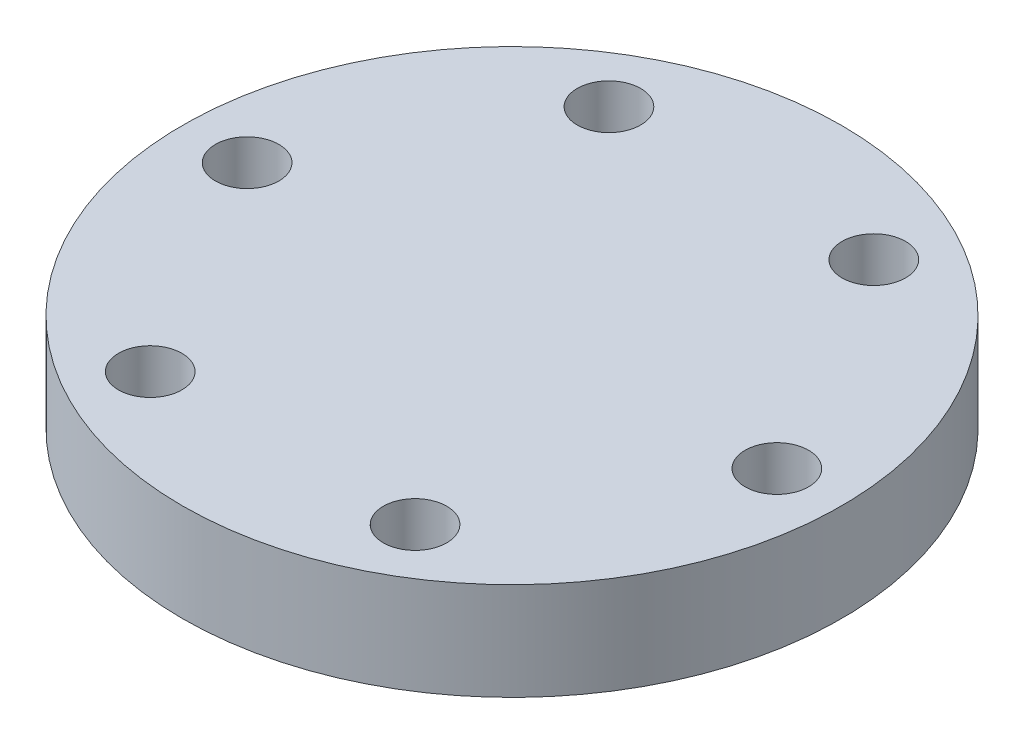
ISO-10303-21;
HEADER;
FILE_DESCRIPTION(('STEP AP214'),'2;1');
FILE_NAME('part.step','',(''),(''),'','','');
FILE_SCHEMA(('AUTOMOTIVE_DESIGN { 1 0 10303 214 1 1 1 1 }'));
ENDSEC;
DATA;
#1=APPLICATION_CONTEXT('core data for automotive mechanical design processes');
#2=APPLICATION_PROTOCOL_DEFINITION('international standard','automotive_design',2000,#1);
#3=PRODUCT_CONTEXT('',#1,'mechanical');
#4=PRODUCT('Part','Part','',(#3));
#5=PRODUCT_RELATED_PRODUCT_CATEGORY('part','',(#4));
#6=PRODUCT_DEFINITION_FORMATION('','',#4);
#7=PRODUCT_DEFINITION_CONTEXT('part definition',#1,'design');
#8=PRODUCT_DEFINITION('design','',#6,#7);
#9=PRODUCT_DEFINITION_SHAPE('','',#8);
#10=(LENGTH_UNIT() NAMED_UNIT(*) SI_UNIT(.MILLI.,.METRE.));
#11=(NAMED_UNIT(*) PLANE_ANGLE_UNIT() SI_UNIT($,.RADIAN.));
#12=(NAMED_UNIT(*) SI_UNIT($,.STERADIAN.) SOLID_ANGLE_UNIT());
#13=UNCERTAINTY_MEASURE_WITH_UNIT(LENGTH_MEASURE(1.E-05),#10,'distance_accuracy_value','');
#14=(GEOMETRIC_REPRESENTATION_CONTEXT(3) GLOBAL_UNCERTAINTY_ASSIGNED_CONTEXT((#13)) GLOBAL_UNIT_ASSIGNED_CONTEXT((#10,
#11,#12)) REPRESENTATION_CONTEXT('',''));
#15=CARTESIAN_POINT('',(0.,0.,0.));
#16=DIRECTION('',(0.,0.,1.));
#17=DIRECTION('',(1.,0.,0.));
#18=AXIS2_PLACEMENT_3D('',#15,#16,#17);
#19=CARTESIAN_POINT('',(0.,8.,0.));
#20=DIRECTION('',(0.,-1.,0.));
#21=DIRECTION('',(0.,0.,-1.));
#22=AXIS2_PLACEMENT_3D('',#19,#20,#21);
#23=CYLINDRICAL_SURFACE('',#22,27.);
#24=CARTESIAN_POINT('',(0.,8.,0.));
#25=DIRECTION('',(0.,1.,0.));
#26=DIRECTION('',(0.,0.,1.));
#27=AXIS2_PLACEMENT_3D('',#24,#25,#26);
#28=CIRCLE('',#27,27.);
#29=CARTESIAN_POINT('',(0.,8.,27.));
#30=VERTEX_POINT('',#29);
#31=EDGE_CURVE('E10',#30,#30,#28,.T.);
#32=ORIENTED_EDGE('',*,*,#31,.F.);
#33=EDGE_LOOP('',(#32));
#34=FACE_BOUND('',#33,.T.);
#35=CARTESIAN_POINT('',(0.,0.,0.));
#36=DIRECTION('',(0.,1.,0.));
#37=DIRECTION('',(0.,0.,1.));
#38=AXIS2_PLACEMENT_3D('',#35,#36,#37);
#39=CIRCLE('',#38,27.);
#40=CARTESIAN_POINT('',(0.,0.,27.));
#41=VERTEX_POINT('',#40);
#42=EDGE_CURVE('E46',#41,#41,#39,.T.);
#43=ORIENTED_EDGE('',*,*,#42,.T.);
#44=EDGE_LOOP('',(#43));
#45=FACE_BOUND('',#44,.T.);
#46=ADVANCED_FACE('F43',(#34,#45),#23,.T.);
#47=CARTESIAN_POINT('',(0.,8.,0.));
#48=DIRECTION('',(0.,1.,0.));
#49=DIRECTION('',(0.,0.,1.));
#50=AXIS2_PLACEMENT_3D('',#47,#48,#49);
#51=PLANE('',#50);
#52=CARTESIAN_POINT('',(-21.7,8.,0.));
#53=DIRECTION('',(0.,1.,0.));
#54=DIRECTION('',(0.,0.,1.));
#55=AXIS2_PLACEMENT_3D('',#52,#53,#54);
#56=CIRCLE('',#55,2.6);
#57=CARTESIAN_POINT('',(-21.7,8.,2.6));
#58=VERTEX_POINT('',#57);
#59=EDGE_CURVE('E80',#58,#58,#56,.T.);
#60=ORIENTED_EDGE('',*,*,#59,.F.);
#61=EDGE_LOOP('',(#60));
#62=FACE_BOUND('',#61,.T.);
#63=CARTESIAN_POINT('',(-10.8500000000002,8.,18.7927512621222));
#64=DIRECTION('',(0.,1.,0.));
#65=DIRECTION('',(0.,0.,1.));
#66=AXIS2_PLACEMENT_3D('',#63,#64,#65);
#67=CIRCLE('',#66,2.6);
#68=CARTESIAN_POINT('',(-10.8500000000002,8.,21.3927512621222));
#69=VERTEX_POINT('',#68);
#70=EDGE_CURVE('E59',#69,#69,#67,.T.);
#71=ORIENTED_EDGE('',*,*,#70,.F.);
#72=EDGE_LOOP('',(#71));
#73=FACE_BOUND('',#72,.T.);
#74=CARTESIAN_POINT('',(10.8499999999998,8.,18.7927512621224));
#75=DIRECTION('',(0.,1.,0.));
#76=DIRECTION('',(0.,0.,1.));
#77=AXIS2_PLACEMENT_3D('',#74,#75,#76);
#78=CIRCLE('',#77,2.6);
#79=CARTESIAN_POINT('',(10.8499999999998,8.,21.3927512621224));
#80=VERTEX_POINT('',#79);
#81=EDGE_CURVE('E58',#80,#80,#78,.T.);
#82=ORIENTED_EDGE('',*,*,#81,.F.);
#83=EDGE_LOOP('',(#82));
#84=FACE_BOUND('',#83,.T.);
#85=CARTESIAN_POINT('',(21.7,8.,1.51530290105792E-13));
#86=DIRECTION('',(0.,1.,0.));
#87=DIRECTION('',(0.,0.,1.));
#88=AXIS2_PLACEMENT_3D('',#85,#86,#87);
#89=CIRCLE('',#88,2.6);
#90=CARTESIAN_POINT('',(21.7,8.,2.60000000000015));
#91=VERTEX_POINT('',#90);
#92=EDGE_CURVE('E65',#91,#91,#89,.T.);
#93=ORIENTED_EDGE('',*,*,#92,.F.);
#94=EDGE_LOOP('',(#93));
#95=FACE_BOUND('',#94,.T.);
#96=CARTESIAN_POINT('',(10.8500000000001,8.,-18.7927512621223));
#97=DIRECTION('',(0.,1.,0.));
#98=DIRECTION('',(0.,0.,1.));
#99=AXIS2_PLACEMENT_3D('',#96,#97,#98);
#100=CIRCLE('',#99,2.6);
#101=CARTESIAN_POINT('',(10.8500000000001,8.,-16.1927512621223));
#102=VERTEX_POINT('',#101);
#103=EDGE_CURVE('E71',#102,#102,#100,.T.);
#104=ORIENTED_EDGE('',*,*,#103,.F.);
#105=EDGE_LOOP('',(#104));
#106=FACE_BOUND('',#105,.T.);
#107=CARTESIAN_POINT('',(-10.85,8.,-18.7927512621223));
#108=DIRECTION('',(0.,1.,0.));
#109=DIRECTION('',(0.,0.,1.));
#110=AXIS2_PLACEMENT_3D('',#107,#108,#109);
#111=CIRCLE('',#110,2.6);
#112=CARTESIAN_POINT('',(-10.85,8.,-16.1927512621223));
#113=VERTEX_POINT('',#112);
#114=EDGE_CURVE('E77',#113,#113,#111,.T.);
#115=ORIENTED_EDGE('',*,*,#114,.F.);
#116=EDGE_LOOP('',(#115));
#117=FACE_BOUND('',#116,.T.);
#118=ORIENTED_EDGE('',*,*,#31,.T.);
#119=EDGE_LOOP('',(#118));
#120=FACE_BOUND('',#119,.T.);
#121=ADVANCED_FACE('F101',(#62,#73,#84,#95,#106,#117,#120),#51,.T.);
#122=CARTESIAN_POINT('',(0.,0.,0.));
#123=DIRECTION('',(0.,1.,0.));
#124=DIRECTION('',(0.,0.,1.));
#125=AXIS2_PLACEMENT_3D('',#122,#123,#124);
#126=PLANE('',#125);
#127=CARTESIAN_POINT('',(-21.7,0.,0.));
#128=DIRECTION('',(0.,1.,0.));
#129=DIRECTION('',(0.,0.,1.));
#130=AXIS2_PLACEMENT_3D('',#127,#128,#129);
#131=CIRCLE('',#130,2.6);
#132=CARTESIAN_POINT('',(-21.7,0.,2.6));
#133=VERTEX_POINT('',#132);
#134=EDGE_CURVE('E53',#133,#133,#131,.T.);
#135=ORIENTED_EDGE('',*,*,#134,.T.);
#136=EDGE_LOOP('',(#135));
#137=FACE_BOUND('',#136,.T.);
#138=CARTESIAN_POINT('',(-10.8500000000002,0.,18.7927512621222));
#139=DIRECTION('',(0.,1.,0.));
#140=DIRECTION('',(0.,0.,1.));
#141=AXIS2_PLACEMENT_3D('',#138,#139,#140);
#142=CIRCLE('',#141,2.6);
#143=CARTESIAN_POINT('',(-10.8500000000002,0.,21.3927512621222));
#144=VERTEX_POINT('',#143);
#145=EDGE_CURVE('E81',#144,#144,#142,.T.);
#146=ORIENTED_EDGE('',*,*,#145,.T.);
#147=EDGE_LOOP('',(#146));
#148=FACE_BOUND('',#147,.T.);
#149=CARTESIAN_POINT('',(10.8499999999998,0.,18.7927512621224));
#150=DIRECTION('',(0.,1.,0.));
#151=DIRECTION('',(0.,0.,1.));
#152=AXIS2_PLACEMENT_3D('',#149,#150,#151);
#153=CIRCLE('',#152,2.6);
#154=CARTESIAN_POINT('',(10.8499999999998,0.,21.3927512621224));
#155=VERTEX_POINT('',#154);
#156=EDGE_CURVE('E55',#155,#155,#153,.T.);
#157=ORIENTED_EDGE('',*,*,#156,.T.);
#158=EDGE_LOOP('',(#157));
#159=FACE_BOUND('',#158,.T.);
#160=CARTESIAN_POINT('',(21.7,0.,1.51530290105792E-13));
#161=DIRECTION('',(0.,1.,0.));
#162=DIRECTION('',(0.,0.,1.));
#163=AXIS2_PLACEMENT_3D('',#160,#161,#162);
#164=CIRCLE('',#163,2.6);
#165=CARTESIAN_POINT('',(21.7,0.,2.60000000000015));
#166=VERTEX_POINT('',#165);
#167=EDGE_CURVE('E62',#166,#166,#164,.T.);
#168=ORIENTED_EDGE('',*,*,#167,.T.);
#169=EDGE_LOOP('',(#168));
#170=FACE_BOUND('',#169,.T.);
#171=CARTESIAN_POINT('',(10.8500000000001,0.,-18.7927512621223));
#172=DIRECTION('',(0.,1.,0.));
#173=DIRECTION('',(0.,0.,1.));
#174=AXIS2_PLACEMENT_3D('',#171,#172,#173);
#175=CIRCLE('',#174,2.6);
#176=CARTESIAN_POINT('',(10.8500000000001,0.,-16.1927512621223));
#177=VERTEX_POINT('',#176);
#178=EDGE_CURVE('E68',#177,#177,#175,.T.);
#179=ORIENTED_EDGE('',*,*,#178,.T.);
#180=EDGE_LOOP('',(#179));
#181=FACE_BOUND('',#180,.T.);
#182=CARTESIAN_POINT('',(-10.85,0.,-18.7927512621223));
#183=DIRECTION('',(0.,1.,0.));
#184=DIRECTION('',(0.,0.,1.));
#185=AXIS2_PLACEMENT_3D('',#182,#183,#184);
#186=CIRCLE('',#185,2.6);
#187=CARTESIAN_POINT('',(-10.85,0.,-16.1927512621223));
#188=VERTEX_POINT('',#187);
#189=EDGE_CURVE('E74',#188,#188,#186,.T.);
#190=ORIENTED_EDGE('',*,*,#189,.T.);
#191=EDGE_LOOP('',(#190));
#192=FACE_BOUND('',#191,.T.);
#193=ORIENTED_EDGE('',*,*,#42,.F.);
#194=EDGE_LOOP('',(#193));
#195=FACE_BOUND('',#194,.T.);
#196=ADVANCED_FACE('F91',(#137,#148,#159,#170,#181,#192,#195),#126,.F.);
#197=CARTESIAN_POINT('',(-10.85,0.,-18.7927512621223));
#198=DIRECTION('',(0.,1.,0.));
#199=DIRECTION('',(0.,0.,1.));
#200=AXIS2_PLACEMENT_3D('',#197,#198,#199);
#201=CYLINDRICAL_SURFACE('',#200,2.6);
#202=ORIENTED_EDGE('',*,*,#189,.F.);
#203=EDGE_LOOP('',(#202));
#204=FACE_BOUND('',#203,.T.);
#205=ORIENTED_EDGE('',*,*,#114,.T.);
#206=EDGE_LOOP('',(#205));
#207=FACE_BOUND('',#206,.T.);
#208=ADVANCED_FACE('F115',(#204,#207),#201,.F.);
#209=CARTESIAN_POINT('',(10.8500000000001,0.,-18.7927512621223));
#210=DIRECTION('',(0.,1.,0.));
#211=DIRECTION('',(0.,0.,1.));
#212=AXIS2_PLACEMENT_3D('',#209,#210,#211);
#213=CYLINDRICAL_SURFACE('',#212,2.6);
#214=ORIENTED_EDGE('',*,*,#178,.F.);
#215=EDGE_LOOP('',(#214));
#216=FACE_BOUND('',#215,.T.);
#217=ORIENTED_EDGE('',*,*,#103,.T.);
#218=EDGE_LOOP('',(#217));
#219=FACE_BOUND('',#218,.T.);
#220=ADVANCED_FACE('F117',(#216,#219),#213,.F.);
#221=CARTESIAN_POINT('',(21.7,0.,1.51530290105792E-13));
#222=DIRECTION('',(0.,1.,0.));
#223=DIRECTION('',(0.,0.,1.));
#224=AXIS2_PLACEMENT_3D('',#221,#222,#223);
#225=CYLINDRICAL_SURFACE('',#224,2.6);
#226=ORIENTED_EDGE('',*,*,#167,.F.);
#227=EDGE_LOOP('',(#226));
#228=FACE_BOUND('',#227,.T.);
#229=ORIENTED_EDGE('',*,*,#92,.T.);
#230=EDGE_LOOP('',(#229));
#231=FACE_BOUND('',#230,.T.);
#232=ADVANCED_FACE('F124',(#228,#231),#225,.F.);
#233=CARTESIAN_POINT('',(10.8499999999998,0.,18.7927512621224));
#234=DIRECTION('',(0.,1.,0.));
#235=DIRECTION('',(0.,0.,1.));
#236=AXIS2_PLACEMENT_3D('',#233,#234,#235);
#237=CYLINDRICAL_SURFACE('',#236,2.6);
#238=ORIENTED_EDGE('',*,*,#156,.F.);
#239=EDGE_LOOP('',(#238));
#240=FACE_BOUND('',#239,.T.);
#241=ORIENTED_EDGE('',*,*,#81,.T.);
#242=EDGE_LOOP('',(#241));
#243=FACE_BOUND('',#242,.T.);
#244=ADVANCED_FACE('F166',(#240,#243),#237,.F.);
#245=CARTESIAN_POINT('',(-10.8500000000002,0.,18.7927512621222));
#246=DIRECTION('',(0.,1.,0.));
#247=DIRECTION('',(0.,0.,1.));
#248=AXIS2_PLACEMENT_3D('',#245,#246,#247);
#249=CYLINDRICAL_SURFACE('',#248,2.6);
#250=ORIENTED_EDGE('',*,*,#145,.F.);
#251=EDGE_LOOP('',(#250));
#252=FACE_BOUND('',#251,.T.);
#253=ORIENTED_EDGE('',*,*,#70,.T.);
#254=EDGE_LOOP('',(#253));
#255=FACE_BOUND('',#254,.T.);
#256=ADVANCED_FACE('F97',(#252,#255),#249,.F.);
#257=CARTESIAN_POINT('',(-21.7,0.,0.));
#258=DIRECTION('',(0.,1.,0.));
#259=DIRECTION('',(0.,0.,1.));
#260=AXIS2_PLACEMENT_3D('',#257,#258,#259);
#261=CYLINDRICAL_SURFACE('',#260,2.6);
#262=ORIENTED_EDGE('',*,*,#134,.F.);
#263=EDGE_LOOP('',(#262));
#264=FACE_BOUND('',#263,.T.);
#265=ORIENTED_EDGE('',*,*,#59,.T.);
#266=EDGE_LOOP('',(#265));
#267=FACE_BOUND('',#266,.T.);
#268=ADVANCED_FACE('F94',(#264,#267),#261,.F.);
#269=CLOSED_SHELL('',(#46,#121,#196,#208,#220,#232,#244,#256,#268));
#270=MANIFOLD_SOLID_BREP('B2',#269);
#271=ADVANCED_BREP_SHAPE_REPRESENTATION('',(#18,#270),#14);
#272=SHAPE_DEFINITION_REPRESENTATION(#9,#271);
ENDSEC;
END-ISO-10303-21;
